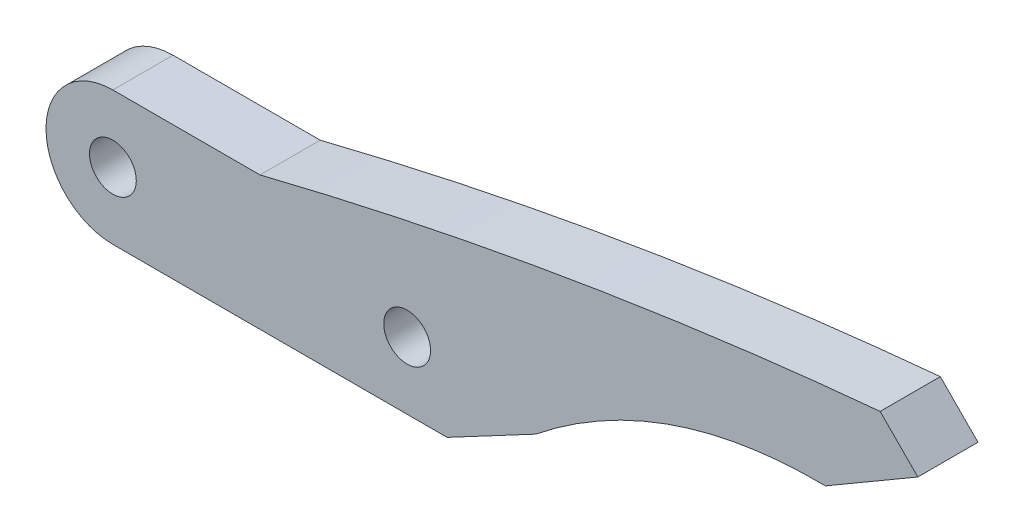
ISO-10303-21;
HEADER;
FILE_DESCRIPTION(('STEP AP214'),'2;1');
FILE_NAME('part.step','',(''),(''),'','','');
FILE_SCHEMA(('AUTOMOTIVE_DESIGN { 1 0 10303 214 1 1 1 1 }'));
ENDSEC;
DATA;
#1=APPLICATION_CONTEXT('core data for automotive mechanical design processes');
#2=APPLICATION_PROTOCOL_DEFINITION('international standard','automotive_design',2000,#1);
#3=PRODUCT_CONTEXT('',#1,'mechanical');
#4=PRODUCT('Part','Part','',(#3));
#5=PRODUCT_RELATED_PRODUCT_CATEGORY('part','',(#4));
#6=PRODUCT_DEFINITION_FORMATION('','',#4);
#7=PRODUCT_DEFINITION_CONTEXT('part definition',#1,'design');
#8=PRODUCT_DEFINITION('design','',#6,#7);
#9=PRODUCT_DEFINITION_SHAPE('','',#8);
#10=(LENGTH_UNIT() NAMED_UNIT(*) SI_UNIT(.MILLI.,.METRE.));
#11=(NAMED_UNIT(*) PLANE_ANGLE_UNIT() SI_UNIT($,.RADIAN.));
#12=(NAMED_UNIT(*) SI_UNIT($,.STERADIAN.) SOLID_ANGLE_UNIT());
#13=UNCERTAINTY_MEASURE_WITH_UNIT(LENGTH_MEASURE(1.E-05),#10,'distance_accuracy_value','');
#14=(GEOMETRIC_REPRESENTATION_CONTEXT(3) GLOBAL_UNCERTAINTY_ASSIGNED_CONTEXT((#13)) GLOBAL_UNIT_ASSIGNED_CONTEXT((#10,
#11,#12)) REPRESENTATION_CONTEXT('',''));
#15=CARTESIAN_POINT('',(0.,0.,0.));
#16=DIRECTION('',(0.,0.,1.));
#17=DIRECTION('',(1.,0.,0.));
#18=AXIS2_PLACEMENT_3D('',#15,#16,#17);
#19=CARTESIAN_POINT('',(0.,5.,4.5));
#20=DIRECTION('',(0.,1.,0.));
#21=DIRECTION('',(0.,0.,1.));
#22=AXIS2_PLACEMENT_3D('',#19,#20,#21);
#23=PLANE('',#22);
#24=DIRECTION('',(1.,0.,0.));
#25=VECTOR('',#24,1.);
#26=CARTESIAN_POINT('',(0.,5.,4.5));
#27=LINE('',#26,#25);
#28=CARTESIAN_POINT('',(-11.,5.,4.5));
#29=VERTEX_POINT('',#28);
#30=CARTESIAN_POINT('',(0.,5.,4.5));
#31=VERTEX_POINT('',#30);
#32=EDGE_CURVE('E122',#29,#31,#27,.T.);
#33=ORIENTED_EDGE('',*,*,#32,.T.);
#34=DIRECTION('',(0.,0.,1.));
#35=VECTOR('',#34,1.);
#36=CARTESIAN_POINT('',(0.,5.,-52.3267387246768));
#37=LINE('',#36,#35);
#38=CARTESIAN_POINT('',(0.,5.,0.));
#39=VERTEX_POINT('',#38);
#40=EDGE_CURVE('E106',#39,#31,#37,.T.);
#41=ORIENTED_EDGE('',*,*,#40,.F.);
#42=DIRECTION('',(1.,0.,0.));
#43=VECTOR('',#42,1.);
#44=CARTESIAN_POINT('',(0.,5.,0.));
#45=LINE('',#44,#43);
#46=CARTESIAN_POINT('',(-11.,5.,0.));
#47=VERTEX_POINT('',#46);
#48=EDGE_CURVE('E143',#47,#39,#45,.T.);
#49=ORIENTED_EDGE('',*,*,#48,.F.);
#50=DIRECTION('',(0.,0.,-1.));
#51=VECTOR('',#50,1.);
#52=CARTESIAN_POINT('',(-11.,5.,4.5));
#53=LINE('',#52,#51);
#54=EDGE_CURVE('E47',#29,#47,#53,.T.);
#55=ORIENTED_EDGE('',*,*,#54,.F.);
#56=EDGE_LOOP('',(#33,#41,#49,#55));
#57=FACE_BOUND('',#56,.T.);
#58=ADVANCED_FACE('F38',(#57),#23,.T.);
#59=CARTESIAN_POINT('',(-11.,0.,4.5));
#60=DIRECTION('',(0.,0.,-1.));
#61=DIRECTION('',(-1.,0.,0.));
#62=AXIS2_PLACEMENT_3D('',#59,#60,#61);
#63=CYLINDRICAL_SURFACE('',#62,5.);
#64=CARTESIAN_POINT('',(-11.,0.,0.));
#65=DIRECTION('',(0.,0.,1.));
#66=DIRECTION('',(1.,0.,0.));
#67=AXIS2_PLACEMENT_3D('',#64,#65,#66);
#68=CIRCLE('',#67,5.);
#69=CARTESIAN_POINT('',(-11.,-5.,0.));
#70=VERTEX_POINT('',#69);
#71=EDGE_CURVE('E139',#47,#70,#68,.T.);
#72=ORIENTED_EDGE('',*,*,#71,.T.);
#73=DIRECTION('',(0.,0.,-1.));
#74=VECTOR('',#73,1.);
#75=CARTESIAN_POINT('',(-11.,-5.,4.5));
#76=LINE('',#75,#74);
#77=CARTESIAN_POINT('',(-11.,-5.,4.5));
#78=VERTEX_POINT('',#77);
#79=EDGE_CURVE('E11',#78,#70,#76,.T.);
#80=ORIENTED_EDGE('',*,*,#79,.F.);
#81=CARTESIAN_POINT('',(-11.,0.,4.5));
#82=DIRECTION('',(0.,0.,1.));
#83=DIRECTION('',(1.,0.,0.));
#84=AXIS2_PLACEMENT_3D('',#81,#82,#83);
#85=CIRCLE('',#84,5.);
#86=EDGE_CURVE('E132',#29,#78,#85,.T.);
#87=ORIENTED_EDGE('',*,*,#86,.F.);
#88=ORIENTED_EDGE('',*,*,#54,.T.);
#89=EDGE_LOOP('',(#72,#80,#87,#88));
#90=FACE_BOUND('',#89,.T.);
#91=ADVANCED_FACE('F149',(#90),#63,.T.);
#92=CARTESIAN_POINT('',(0.,-5.,4.5));
#93=DIRECTION('',(0.,1.,0.));
#94=DIRECTION('',(0.,0.,1.));
#95=AXIS2_PLACEMENT_3D('',#92,#93,#94);
#96=PLANE('',#95);
#97=DIRECTION('',(1.,0.,0.));
#98=VECTOR('',#97,1.);
#99=CARTESIAN_POINT('',(0.,-5.,0.));
#100=LINE('',#99,#98);
#101=CARTESIAN_POINT('',(13.99,-5.,0.));
#102=VERTEX_POINT('',#101);
#103=EDGE_CURVE('E66',#70,#102,#100,.T.);
#104=ORIENTED_EDGE('',*,*,#103,.T.);
#105=DIRECTION('',(0.,0.,1.));
#106=VECTOR('',#105,1.);
#107=CARTESIAN_POINT('',(13.99,-5.,-52.3267387246768));
#108=LINE('',#107,#106);
#109=CARTESIAN_POINT('',(13.99,-5.,4.5));
#110=VERTEX_POINT('',#109);
#111=EDGE_CURVE('E113',#102,#110,#108,.T.);
#112=ORIENTED_EDGE('',*,*,#111,.T.);
#113=DIRECTION('',(1.,0.,0.));
#114=VECTOR('',#113,1.);
#115=CARTESIAN_POINT('',(0.,-5.,4.5));
#116=LINE('',#115,#114);
#117=EDGE_CURVE('E128',#78,#110,#116,.T.);
#118=ORIENTED_EDGE('',*,*,#117,.F.);
#119=ORIENTED_EDGE('',*,*,#79,.T.);
#120=EDGE_LOOP('',(#104,#112,#118,#119));
#121=FACE_BOUND('',#120,.T.);
#122=ADVANCED_FACE('F199',(#121),#96,.F.);
#123=CARTESIAN_POINT('',(-11.,0.,4.5));
#124=DIRECTION('',(0.,0.,-1.));
#125=DIRECTION('',(-1.,0.,0.));
#126=AXIS2_PLACEMENT_3D('',#123,#124,#125);
#127=CYLINDRICAL_SURFACE('',#126,1.75);
#128=CARTESIAN_POINT('',(-11.,0.,4.5));
#129=DIRECTION('',(0.,0.,1.));
#130=DIRECTION('',(1.,0.,0.));
#131=AXIS2_PLACEMENT_3D('',#128,#129,#130);
#132=CIRCLE('',#131,1.75);
#133=CARTESIAN_POINT('',(-9.25,0.,4.5));
#134=VERTEX_POINT('',#133);
#135=EDGE_CURVE('E147',#134,#134,#132,.T.);
#136=ORIENTED_EDGE('',*,*,#135,.T.);
#137=EDGE_LOOP('',(#136));
#138=FACE_BOUND('',#137,.T.);
#139=CARTESIAN_POINT('',(-11.,0.,0.));
#140=DIRECTION('',(0.,0.,1.));
#141=DIRECTION('',(1.,0.,0.));
#142=AXIS2_PLACEMENT_3D('',#139,#140,#141);
#143=CIRCLE('',#142,1.75);
#144=CARTESIAN_POINT('',(-9.25,0.,0.));
#145=VERTEX_POINT('',#144);
#146=EDGE_CURVE('E136',#145,#145,#143,.T.);
#147=ORIENTED_EDGE('',*,*,#146,.F.);
#148=EDGE_LOOP('',(#147));
#149=FACE_BOUND('',#148,.T.);
#150=ADVANCED_FACE('F40',(#138,#149),#127,.F.);
#151=CARTESIAN_POINT('',(11.,0.,4.5));
#152=DIRECTION('',(0.,0.,-1.));
#153=DIRECTION('',(-1.,0.,0.));
#154=AXIS2_PLACEMENT_3D('',#151,#152,#153);
#155=CYLINDRICAL_SURFACE('',#154,1.75);
#156=CARTESIAN_POINT('',(11.,0.,4.5));
#157=DIRECTION('',(0.,0.,1.));
#158=DIRECTION('',(1.,0.,0.));
#159=AXIS2_PLACEMENT_3D('',#156,#157,#158);
#160=CIRCLE('',#159,1.75);
#161=CARTESIAN_POINT('',(12.75,0.,4.5));
#162=VERTEX_POINT('',#161);
#163=EDGE_CURVE('E127',#162,#162,#160,.F.);
#164=ORIENTED_EDGE('',*,*,#163,.F.);
#165=EDGE_LOOP('',(#164));
#166=FACE_BOUND('',#165,.T.);
#167=CARTESIAN_POINT('',(11.,0.,0.));
#168=DIRECTION('',(0.,0.,1.));
#169=DIRECTION('',(1.,0.,0.));
#170=AXIS2_PLACEMENT_3D('',#167,#168,#169);
#171=CIRCLE('',#170,1.75);
#172=CARTESIAN_POINT('',(12.75,0.,0.));
#173=VERTEX_POINT('',#172);
#174=EDGE_CURVE('E145',#173,#173,#171,.F.);
#175=ORIENTED_EDGE('',*,*,#174,.T.);
#176=EDGE_LOOP('',(#175));
#177=FACE_BOUND('',#176,.T.);
#178=ADVANCED_FACE('F190',(#166,#177),#155,.F.);
#179=CARTESIAN_POINT('',(0.,0.,4.5));
#180=DIRECTION('',(0.,0.,1.));
#181=DIRECTION('',(1.,0.,0.));
#182=AXIS2_PLACEMENT_3D('',#179,#180,#181);
#183=PLANE('',#182);
#184=CARTESIAN_POINT('',(0.,5.,4.5));
#185=CARTESIAN_POINT('',(22.8855175011126,10.7079266509718,4.5));
#186=CARTESIAN_POINT('',(46.3639891994318,12.87,4.5));
#187=B_SPLINE_CURVE_WITH_KNOTS('',2,(#184,#185,#186),.UNSPECIFIED.,.F.,.F.,(3,3),(0.,1.),.UNSPECIFIED.);
#188=CARTESIAN_POINT('',(46.3639891994318,12.87,4.5));
#189=VERTEX_POINT('',#188);
#190=EDGE_CURVE('E110',#31,#189,#187,.T.);
#191=ORIENTED_EDGE('',*,*,#190,.F.);
#192=ORIENTED_EDGE('',*,*,#32,.F.);
#193=ORIENTED_EDGE('',*,*,#86,.T.);
#194=ORIENTED_EDGE('',*,*,#117,.T.);
#195=DIRECTION('',(-0.882942972945771,-0.469480251475697,0.));
#196=VECTOR('',#195,1.);
#197=CARTESIAN_POINT('',(5.15618121918072,-9.69713627016373,4.5));
#198=LINE('',#197,#196);
#199=CARTESIAN_POINT('',(20.61,-1.48,4.5));
#200=VERTEX_POINT('',#199);
#201=EDGE_CURVE('E125',#200,#110,#198,.T.);
#202=ORIENTED_EDGE('',*,*,#201,.F.);
#203=CARTESIAN_POINT('',(42.27,6.,4.5));
#204=CARTESIAN_POINT('',(30.1461507480521,6.15734830451268,4.5));
#205=CARTESIAN_POINT('',(20.61,-1.48,4.5));
#206=B_SPLINE_CURVE_WITH_KNOTS('',2,(#203,#204,#205),.UNSPECIFIED.,.F.,.F.,(3,3),(0.,1.),.UNSPECIFIED.);
#207=CARTESIAN_POINT('',(42.27,5.99999999999999,4.5));
#208=VERTEX_POINT('',#207);
#209=EDGE_CURVE('E334',#208,#200,#206,.T.);
#210=ORIENTED_EDGE('',*,*,#209,.F.);
#211=DIRECTION('',(-0.863849487758139,-0.50375,0.));
#212=VECTOR('',#211,1.);
#213=CARTESIAN_POINT('',(8.11562184512604,-13.9169742406966,4.5));
#214=LINE('',#213,#212);
#215=CARTESIAN_POINT('',(49.1807959020651,10.03,4.5));
#216=VERTEX_POINT('',#215);
#217=EDGE_CURVE('E313',#216,#208,#214,.T.);
#218=ORIENTED_EDGE('',*,*,#217,.F.);
#219=DIRECTION('',(0.704201675658332,-0.709999999999999,0.));
#220=VECTOR('',#219,1.);
#221=CARTESIAN_POINT('',(29.8068706070966,29.5634482079557,4.5));
#222=LINE('',#221,#220);
#223=EDGE_CURVE('E114',#189,#216,#222,.T.);
#224=ORIENTED_EDGE('',*,*,#223,.F.);
#225=EDGE_LOOP('',(#191,#192,#193,#194,#202,#210,#218,#224));
#226=FACE_BOUND('',#225,.T.);
#227=ORIENTED_EDGE('',*,*,#135,.F.);
#228=EDGE_LOOP('',(#227));
#229=FACE_BOUND('',#228,.T.);
#230=ORIENTED_EDGE('',*,*,#163,.T.);
#231=EDGE_LOOP('',(#230));
#232=FACE_BOUND('',#231,.T.);
#233=ADVANCED_FACE('F119',(#226,#229,#232),#183,.T.);
#234=CARTESIAN_POINT('',(0.,0.,0.));
#235=DIRECTION('',(0.,0.,1.));
#236=DIRECTION('',(1.,0.,0.));
#237=AXIS2_PLACEMENT_3D('',#234,#235,#236);
#238=PLANE('',#237);
#239=ORIENTED_EDGE('',*,*,#146,.T.);
#240=EDGE_LOOP('',(#239));
#241=FACE_BOUND('',#240,.T.);
#242=ORIENTED_EDGE('',*,*,#71,.F.);
#243=ORIENTED_EDGE('',*,*,#48,.T.);
#244=CARTESIAN_POINT('',(0.,5.,0.));
#245=CARTESIAN_POINT('',(22.8855175011126,10.7079266509718,0.));
#246=CARTESIAN_POINT('',(46.3639891994318,12.87,0.));
#247=B_SPLINE_CURVE_WITH_KNOTS('',2,(#244,#245,#246),.UNSPECIFIED.,.F.,.F.,(3,3),(0.,1.),.UNSPECIFIED.);
#248=CARTESIAN_POINT('',(46.3639891994318,12.87,0.));
#249=VERTEX_POINT('',#248);
#250=EDGE_CURVE('E111',#249,#39,#247,.F.);
#251=ORIENTED_EDGE('',*,*,#250,.F.);
#252=DIRECTION('',(-0.704201675658332,0.709999999999999,0.));
#253=VECTOR('',#252,1.);
#254=CARTESIAN_POINT('',(29.8068706070966,29.5634482079557,0.));
#255=LINE('',#254,#253);
#256=CARTESIAN_POINT('',(49.1807959020651,10.03,0.));
#257=VERTEX_POINT('',#256);
#258=EDGE_CURVE('E72',#257,#249,#255,.T.);
#259=ORIENTED_EDGE('',*,*,#258,.F.);
#260=DIRECTION('',(0.863849487758139,0.50375,0.));
#261=VECTOR('',#260,1.);
#262=CARTESIAN_POINT('',(8.11562184512604,-13.9169742406966,0.));
#263=LINE('',#262,#261);
#264=CARTESIAN_POINT('',(42.27,6.,0.));
#265=VERTEX_POINT('',#264);
#266=EDGE_CURVE('E161',#265,#257,#263,.T.);
#267=ORIENTED_EDGE('',*,*,#266,.F.);
#268=CARTESIAN_POINT('',(42.27,6.,0.));
#269=CARTESIAN_POINT('',(30.1461507480521,6.15734830451268,0.));
#270=CARTESIAN_POINT('',(20.61,-1.48,0.));
#271=B_SPLINE_CURVE_WITH_KNOTS('',2,(#268,#269,#270),.UNSPECIFIED.,.F.,.F.,(3,3),(0.,1.),.UNSPECIFIED.);
#272=CARTESIAN_POINT('',(20.61,-1.48,0.));
#273=VERTEX_POINT('',#272);
#274=EDGE_CURVE('E163',#273,#265,#271,.F.);
#275=ORIENTED_EDGE('',*,*,#274,.F.);
#276=DIRECTION('',(0.882942972945771,0.469480251475697,0.));
#277=VECTOR('',#276,1.);
#278=CARTESIAN_POINT('',(5.15618121918072,-9.69713627016373,0.));
#279=LINE('',#278,#277);
#280=EDGE_CURVE('E156',#102,#273,#279,.T.);
#281=ORIENTED_EDGE('',*,*,#280,.F.);
#282=ORIENTED_EDGE('',*,*,#103,.F.);
#283=EDGE_LOOP('',(#242,#243,#251,#259,#267,#275,#281,#282));
#284=FACE_BOUND('',#283,.T.);
#285=ORIENTED_EDGE('',*,*,#174,.F.);
#286=EDGE_LOOP('',(#285));
#287=FACE_BOUND('',#286,.T.);
#288=ADVANCED_FACE('F151',(#241,#284,#287),#238,.F.);
#289=CARTESIAN_POINT('',(5.15618121918072,-9.69713627016373,-52.3267387246768));
#290=DIRECTION('',(-0.469480251475697,0.882942972945771,0.));
#291=DIRECTION('',(-0.882942972945771,-0.469480251475697,0.));
#292=AXIS2_PLACEMENT_3D('',#289,#290,#291);
#293=PLANE('',#292);
#294=ORIENTED_EDGE('',*,*,#111,.F.);
#295=ORIENTED_EDGE('',*,*,#280,.T.);
#296=DIRECTION('',(0.,0.,1.));
#297=VECTOR('',#296,1.);
#298=CARTESIAN_POINT('',(20.61,-1.48,-52.3267387246768));
#299=LINE('',#298,#297);
#300=EDGE_CURVE('E316',#273,#200,#299,.T.);
#301=ORIENTED_EDGE('',*,*,#300,.T.);
#302=ORIENTED_EDGE('',*,*,#201,.T.);
#303=EDGE_LOOP('',(#294,#295,#301,#302));
#304=FACE_BOUND('',#303,.T.);
#305=ADVANCED_FACE('F186',(#304),#293,.F.);
#306=CARTESIAN_POINT('',(42.27,6.,-52.3267387246768));
#307=CARTESIAN_POINT('',(30.1461507480521,6.15734830451268,-52.3267387246768));
#308=CARTESIAN_POINT('',(20.61,-1.48,-52.3267387246768));
#309=B_SPLINE_CURVE_WITH_KNOTS('',2,(#306,#307,#308),.UNSPECIFIED.,.F.,.F.,(3,3),(0.,1.),.UNSPECIFIED.);
#310=DIRECTION('',(0.,0.,1.));
#311=VECTOR('',#310,1.);
#312=SURFACE_OF_LINEAR_EXTRUSION('',#309,#311);
#313=ORIENTED_EDGE('',*,*,#300,.F.);
#314=ORIENTED_EDGE('',*,*,#274,.T.);
#315=DIRECTION('',(0.,0.,1.));
#316=VECTOR('',#315,1.);
#317=CARTESIAN_POINT('',(42.27,5.99999999999999,-52.3267387246768));
#318=LINE('',#317,#316);
#319=EDGE_CURVE('E311',#265,#208,#318,.T.);
#320=ORIENTED_EDGE('',*,*,#319,.T.);
#321=ORIENTED_EDGE('',*,*,#209,.T.);
#322=EDGE_LOOP('',(#313,#314,#320,#321));
#323=FACE_BOUND('',#322,.T.);
#324=ADVANCED_FACE('F235',(#323),#312,.F.);
#325=CARTESIAN_POINT('',(8.11562184512604,-13.9169742406966,-52.3267387246768));
#326=DIRECTION('',(-0.50375,0.863849487758139,0.));
#327=DIRECTION('',(-0.863849487758139,-0.50375,0.));
#328=AXIS2_PLACEMENT_3D('',#325,#326,#327);
#329=PLANE('',#328);
#330=ORIENTED_EDGE('',*,*,#319,.F.);
#331=ORIENTED_EDGE('',*,*,#266,.T.);
#332=DIRECTION('',(0.,0.,1.));
#333=VECTOR('',#332,1.);
#334=CARTESIAN_POINT('',(49.1807959020651,10.03,-52.3267387246768));
#335=LINE('',#334,#333);
#336=EDGE_CURVE('E157',#257,#216,#335,.T.);
#337=ORIENTED_EDGE('',*,*,#336,.T.);
#338=ORIENTED_EDGE('',*,*,#217,.T.);
#339=EDGE_LOOP('',(#330,#331,#337,#338));
#340=FACE_BOUND('',#339,.T.);
#341=ADVANCED_FACE('F242',(#340),#329,.F.);
#342=CARTESIAN_POINT('',(29.8068706070966,29.5634482079557,-52.3267387246768));
#343=DIRECTION('',(-0.709999999999999,-0.704201675658332,0.));
#344=DIRECTION('',(0.704201675658332,-0.709999999999999,0.));
#345=AXIS2_PLACEMENT_3D('',#342,#343,#344);
#346=PLANE('',#345);
#347=ORIENTED_EDGE('',*,*,#336,.F.);
#348=ORIENTED_EDGE('',*,*,#258,.T.);
#349=DIRECTION('',(0.,0.,1.));
#350=VECTOR('',#349,1.);
#351=CARTESIAN_POINT('',(46.3639891994318,12.87,-52.3267387246768));
#352=LINE('',#351,#350);
#353=EDGE_CURVE('E154',#249,#189,#352,.T.);
#354=ORIENTED_EDGE('',*,*,#353,.T.);
#355=ORIENTED_EDGE('',*,*,#223,.T.);
#356=EDGE_LOOP('',(#347,#348,#354,#355));
#357=FACE_BOUND('',#356,.T.);
#358=ADVANCED_FACE('F159',(#357),#346,.F.);
#359=CARTESIAN_POINT('',(0.,5.,-52.3267387246768));
#360=CARTESIAN_POINT('',(22.8855175011126,10.7079266509718,-52.3267387246768));
#361=CARTESIAN_POINT('',(46.3639891994318,12.87,-52.3267387246768));
#362=B_SPLINE_CURVE_WITH_KNOTS('',2,(#359,#360,#361),.UNSPECIFIED.,.F.,.F.,(3,3),(0.,1.),.UNSPECIFIED.);
#363=DIRECTION('',(0.,0.,1.));
#364=VECTOR('',#363,1.);
#365=SURFACE_OF_LINEAR_EXTRUSION('',#362,#364);
#366=ORIENTED_EDGE('',*,*,#353,.F.);
#367=ORIENTED_EDGE('',*,*,#250,.T.);
#368=ORIENTED_EDGE('',*,*,#40,.T.);
#369=ORIENTED_EDGE('',*,*,#190,.T.);
#370=EDGE_LOOP('',(#366,#367,#368,#369));
#371=FACE_BOUND('',#370,.T.);
#372=ADVANCED_FACE('F109',(#371),#365,.F.);
#373=CLOSED_SHELL('',(#58,#91,#122,#150,#178,#233,#288,#305,#324,#341,#358,#372));
#374=MANIFOLD_SOLID_BREP('B2',#373);
#375=ADVANCED_BREP_SHAPE_REPRESENTATION('',(#18,#374),#14);
#376=SHAPE_DEFINITION_REPRESENTATION(#9,#375);
ENDSEC;
END-ISO-10303-21;
